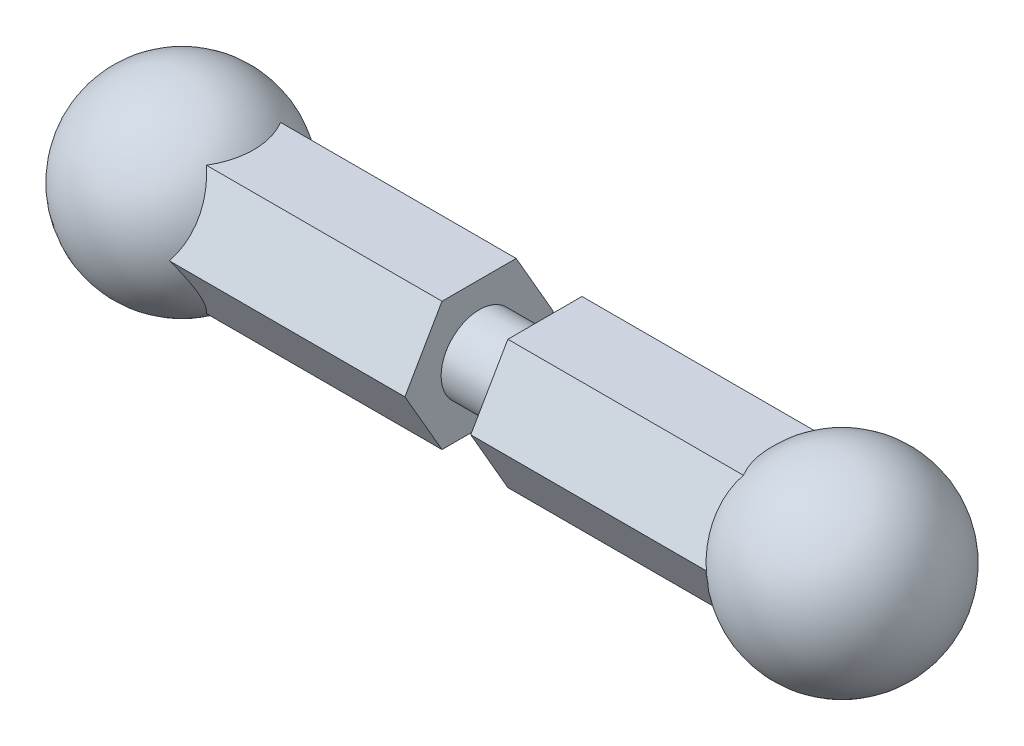
ISO-10303-21;
HEADER;
FILE_DESCRIPTION(('STEP AP214'),'2;1');
FILE_NAME('part.step','',(''),(''),'','','');
FILE_SCHEMA(('AUTOMOTIVE_DESIGN { 1 0 10303 214 1 1 1 1 }'));
ENDSEC;
DATA;
#1=APPLICATION_CONTEXT('core data for automotive mechanical design processes');
#2=APPLICATION_PROTOCOL_DEFINITION('international standard','automotive_design',2000,#1);
#3=PRODUCT_CONTEXT('',#1,'mechanical');
#4=PRODUCT('Part','Part','',(#3));
#5=PRODUCT_RELATED_PRODUCT_CATEGORY('part','',(#4));
#6=PRODUCT_DEFINITION_FORMATION('','',#4);
#7=PRODUCT_DEFINITION_CONTEXT('part definition',#1,'design');
#8=PRODUCT_DEFINITION('design','',#6,#7);
#9=PRODUCT_DEFINITION_SHAPE('','',#8);
#10=(LENGTH_UNIT() NAMED_UNIT(*) SI_UNIT(.MILLI.,.METRE.));
#11=(NAMED_UNIT(*) PLANE_ANGLE_UNIT() SI_UNIT($,.RADIAN.));
#12=(NAMED_UNIT(*) SI_UNIT($,.STERADIAN.) SOLID_ANGLE_UNIT());
#13=UNCERTAINTY_MEASURE_WITH_UNIT(LENGTH_MEASURE(1.E-05),#10,'distance_accuracy_value','');
#14=(GEOMETRIC_REPRESENTATION_CONTEXT(3) GLOBAL_UNCERTAINTY_ASSIGNED_CONTEXT((#13)) GLOBAL_UNIT_ASSIGNED_CONTEXT((#10,
#11,#12)) REPRESENTATION_CONTEXT('',''));
#15=CARTESIAN_POINT('',(0.,0.,0.));
#16=DIRECTION('',(0.,0.,1.));
#17=DIRECTION('',(1.,0.,0.));
#18=AXIS2_PLACEMENT_3D('',#15,#16,#17);
#19=CARTESIAN_POINT('',(11.3,2.,-1.15470053837925));
#20=DIRECTION('',(0.,-1.,0.));
#21=DIRECTION('',(0.,0.,-1.));
#22=AXIS2_PLACEMENT_3D('',#19,#20,#21);
#23=PLANE('',#22);
#24=DIRECTION('',(1.,0.,0.));
#25=VECTOR('',#24,1.);
#26=CARTESIAN_POINT('',(11.3,2.,-1.15470053837925));
#27=LINE('',#26,#25);
#28=CARTESIAN_POINT('',(11.3,2.,-1.15470053837925));
#29=VERTEX_POINT('',#28);
#30=CARTESIAN_POINT('',(18.6351457844873,2.,-1.15470053837925));
#31=VERTEX_POINT('',#30);
#32=EDGE_CURVE('E113',#29,#31,#27,.T.);
#33=ORIENTED_EDGE('',*,*,#32,.F.);
#34=DIRECTION('',(0.,0.,1.));
#35=VECTOR('',#34,1.);
#36=CARTESIAN_POINT('',(11.3,2.,-1.15470053837925));
#37=LINE('',#36,#35);
#38=CARTESIAN_POINT('',(11.3,2.,1.15470053837925));
#39=VERTEX_POINT('',#38);
#40=EDGE_CURVE('E103',#29,#39,#37,.T.);
#41=ORIENTED_EDGE('',*,*,#40,.T.);
#42=DIRECTION('',(1.,0.,0.));
#43=VECTOR('',#42,1.);
#44=CARTESIAN_POINT('',(11.3,2.,1.15470053837925));
#45=LINE('',#44,#43);
#46=CARTESIAN_POINT('',(18.6351457844873,2.,1.15470053837925));
#47=VERTEX_POINT('',#46);
#48=EDGE_CURVE('E67',#39,#47,#45,.T.);
#49=ORIENTED_EDGE('',*,*,#48,.T.);
#50=CARTESIAN_POINT('',(20.55,2.,0.));
#51=DIRECTION('',(0.,1.,0.));
#52=DIRECTION('',(0.,0.,-1.));
#53=AXIS2_PLACEMENT_3D('',#50,#51,#52);
#54=CIRCLE('',#53,2.23606797749979);
#55=EDGE_CURVE('E12',#31,#47,#54,.T.);
#56=ORIENTED_EDGE('',*,*,#55,.F.);
#57=EDGE_LOOP('',(#33,#41,#49,#56));
#58=FACE_BOUND('',#57,.T.);
#59=ADVANCED_FACE('F49',(#58),#23,.F.);
#60=CARTESIAN_POINT('',(11.3,2.,1.15470053837925));
#61=DIRECTION('',(0.,-0.5,-0.866025403784439));
#62=DIRECTION('',(0.,0.866025403784439,-0.5));
#63=AXIS2_PLACEMENT_3D('',#60,#61,#62);
#64=PLANE('',#63);
#65=ORIENTED_EDGE('',*,*,#48,.F.);
#66=DIRECTION('',(0.,-0.866025403784438,0.5));
#67=VECTOR('',#66,1.);
#68=CARTESIAN_POINT('',(11.3,2.,1.15470053837925));
#69=LINE('',#68,#67);
#70=CARTESIAN_POINT('',(11.3,0.,2.3094010767585));
#71=VERTEX_POINT('',#70);
#72=EDGE_CURVE('E101',#39,#71,#69,.T.);
#73=ORIENTED_EDGE('',*,*,#72,.T.);
#74=DIRECTION('',(1.,0.,0.));
#75=VECTOR('',#74,1.);
#76=CARTESIAN_POINT('',(11.3,0.,2.3094010767585));
#77=LINE('',#76,#75);
#78=CARTESIAN_POINT('',(18.6351457844873,0.,2.3094010767585));
#79=VERTEX_POINT('',#78);
#80=EDGE_CURVE('E141',#71,#79,#77,.T.);
#81=ORIENTED_EDGE('',*,*,#80,.T.);
#82=CARTESIAN_POINT('',(20.55,1.,1.73205080756888));
#83=DIRECTION('',(0.,0.5,0.866025403784439));
#84=DIRECTION('',(0.,0.866025403784439,-0.5));
#85=AXIS2_PLACEMENT_3D('',#82,#83,#84);
#86=CIRCLE('',#85,2.23606797749979);
#87=EDGE_CURVE('E57',#47,#79,#86,.T.);
#88=ORIENTED_EDGE('',*,*,#87,.F.);
#89=EDGE_LOOP('',(#65,#73,#81,#88));
#90=FACE_BOUND('',#89,.T.);
#91=ADVANCED_FACE('F109',(#90),#64,.F.);
#92=CARTESIAN_POINT('',(11.3,0.,2.3094010767585));
#93=DIRECTION('',(0.,0.5,-0.866025403784439));
#94=DIRECTION('',(0.,0.866025403784439,0.5));
#95=AXIS2_PLACEMENT_3D('',#92,#93,#94);
#96=PLANE('',#95);
#97=ORIENTED_EDGE('',*,*,#80,.F.);
#98=DIRECTION('',(0.,-0.866025403784439,-0.5));
#99=VECTOR('',#98,1.);
#100=CARTESIAN_POINT('',(11.3,0.,2.3094010767585));
#101=LINE('',#100,#99);
#102=CARTESIAN_POINT('',(11.3,-2.,1.15470053837925));
#103=VERTEX_POINT('',#102);
#104=EDGE_CURVE('E105',#71,#103,#101,.T.);
#105=ORIENTED_EDGE('',*,*,#104,.T.);
#106=DIRECTION('',(1.,0.,0.));
#107=VECTOR('',#106,1.);
#108=CARTESIAN_POINT('',(11.3,-2.,1.15470053837925));
#109=LINE('',#108,#107);
#110=CARTESIAN_POINT('',(18.6351457844873,-2.,1.15470053837925));
#111=VERTEX_POINT('',#110);
#112=EDGE_CURVE('E136',#103,#111,#109,.T.);
#113=ORIENTED_EDGE('',*,*,#112,.T.);
#114=CARTESIAN_POINT('',(20.55,-1.,1.73205080756888));
#115=DIRECTION('',(0.,-0.5,0.866025403784439));
#116=DIRECTION('',(0.,0.866025403784439,0.5));
#117=AXIS2_PLACEMENT_3D('',#114,#115,#116);
#118=CIRCLE('',#117,2.23606797749979);
#119=EDGE_CURVE('E111',#79,#111,#118,.T.);
#120=ORIENTED_EDGE('',*,*,#119,.F.);
#121=EDGE_LOOP('',(#97,#105,#113,#120));
#122=FACE_BOUND('',#121,.T.);
#123=ADVANCED_FACE('F159',(#122),#96,.F.);
#124=CARTESIAN_POINT('',(11.3,-2.,1.15470053837925));
#125=DIRECTION('',(0.,1.,0.));
#126=DIRECTION('',(0.,0.,1.));
#127=AXIS2_PLACEMENT_3D('',#124,#125,#126);
#128=PLANE('',#127);
#129=ORIENTED_EDGE('',*,*,#112,.F.);
#130=DIRECTION('',(0.,0.,-1.));
#131=VECTOR('',#130,1.);
#132=CARTESIAN_POINT('',(11.3,-2.,1.15470053837925));
#133=LINE('',#132,#131);
#134=CARTESIAN_POINT('',(11.3,-2.,-1.15470053837925));
#135=VERTEX_POINT('',#134);
#136=EDGE_CURVE('E120',#103,#135,#133,.T.);
#137=ORIENTED_EDGE('',*,*,#136,.T.);
#138=DIRECTION('',(1.,0.,0.));
#139=VECTOR('',#138,1.);
#140=CARTESIAN_POINT('',(11.3,-2.,-1.15470053837925));
#141=LINE('',#140,#139);
#142=CARTESIAN_POINT('',(18.6351457844873,-2.,-1.15470053837925));
#143=VERTEX_POINT('',#142);
#144=EDGE_CURVE('E131',#135,#143,#141,.T.);
#145=ORIENTED_EDGE('',*,*,#144,.T.);
#146=CARTESIAN_POINT('',(20.55,-2.,0.));
#147=DIRECTION('',(0.,-1.,0.));
#148=DIRECTION('',(0.,0.,1.));
#149=AXIS2_PLACEMENT_3D('',#146,#147,#148);
#150=CIRCLE('',#149,2.23606797749979);
#151=EDGE_CURVE('E138',#111,#143,#150,.T.);
#152=ORIENTED_EDGE('',*,*,#151,.F.);
#153=EDGE_LOOP('',(#129,#137,#145,#152));
#154=FACE_BOUND('',#153,.T.);
#155=ADVANCED_FACE('F157',(#154),#128,.F.);
#156=CARTESIAN_POINT('',(11.3,-2.,-1.15470053837925));
#157=DIRECTION('',(0.,0.5,0.866025403784439));
#158=DIRECTION('',(0.,-0.866025403784439,0.5));
#159=AXIS2_PLACEMENT_3D('',#156,#157,#158);
#160=PLANE('',#159);
#161=ORIENTED_EDGE('',*,*,#144,.F.);
#162=DIRECTION('',(0.,0.866025403784438,-0.5));
#163=VECTOR('',#162,1.);
#164=CARTESIAN_POINT('',(11.3,-2.,-1.15470053837925));
#165=LINE('',#164,#163);
#166=CARTESIAN_POINT('',(11.3,0.,-2.3094010767585));
#167=VERTEX_POINT('',#166);
#168=EDGE_CURVE('E123',#135,#167,#165,.T.);
#169=ORIENTED_EDGE('',*,*,#168,.T.);
#170=DIRECTION('',(1.,0.,0.));
#171=VECTOR('',#170,1.);
#172=CARTESIAN_POINT('',(11.3,0.,-2.3094010767585));
#173=LINE('',#172,#171);
#174=CARTESIAN_POINT('',(18.6351457844873,0.,-2.3094010767585));
#175=VERTEX_POINT('',#174);
#176=EDGE_CURVE('E128',#167,#175,#173,.T.);
#177=ORIENTED_EDGE('',*,*,#176,.T.);
#178=CARTESIAN_POINT('',(20.55,-1.,-1.73205080756888));
#179=DIRECTION('',(0.,-0.5,-0.866025403784439));
#180=DIRECTION('',(0.,-0.866025403784439,0.5));
#181=AXIS2_PLACEMENT_3D('',#178,#179,#180);
#182=CIRCLE('',#181,2.23606797749979);
#183=EDGE_CURVE('E133',#143,#175,#182,.T.);
#184=ORIENTED_EDGE('',*,*,#183,.F.);
#185=EDGE_LOOP('',(#161,#169,#177,#184));
#186=FACE_BOUND('',#185,.T.);
#187=ADVANCED_FACE('F154',(#186),#160,.F.);
#188=CARTESIAN_POINT('',(11.3,0.,-2.3094010767585));
#189=DIRECTION('',(0.,-0.5,0.866025403784439));
#190=DIRECTION('',(0.,-0.866025403784439,-0.5));
#191=AXIS2_PLACEMENT_3D('',#188,#189,#190);
#192=PLANE('',#191);
#193=ORIENTED_EDGE('',*,*,#176,.F.);
#194=DIRECTION('',(0.,0.866025403784439,0.5));
#195=VECTOR('',#194,1.);
#196=CARTESIAN_POINT('',(11.3,0.,-2.3094010767585));
#197=LINE('',#196,#195);
#198=EDGE_CURVE('E126',#167,#29,#197,.T.);
#199=ORIENTED_EDGE('',*,*,#198,.T.);
#200=ORIENTED_EDGE('',*,*,#32,.T.);
#201=CARTESIAN_POINT('',(20.55,1.,-1.73205080756888));
#202=DIRECTION('',(0.,0.5,-0.866025403784439));
#203=DIRECTION('',(0.,-0.866025403784439,-0.5));
#204=AXIS2_PLACEMENT_3D('',#201,#202,#203);
#205=CIRCLE('',#204,2.23606797749979);
#206=EDGE_CURVE('E114',#175,#31,#205,.T.);
#207=ORIENTED_EDGE('',*,*,#206,.F.);
#208=EDGE_LOOP('',(#193,#199,#200,#207));
#209=FACE_BOUND('',#208,.T.);
#210=ADVANCED_FACE('F150',(#209),#192,.F.);
#211=CARTESIAN_POINT('',(11.3,0.,0.));
#212=DIRECTION('',(-1.,0.,0.));
#213=DIRECTION('',(0.,0.,-1.));
#214=AXIS2_PLACEMENT_3D('',#211,#212,#213);
#215=PLANE('',#214);
#216=ORIENTED_EDGE('',*,*,#40,.F.);
#217=ORIENTED_EDGE('',*,*,#198,.F.);
#218=ORIENTED_EDGE('',*,*,#168,.F.);
#219=ORIENTED_EDGE('',*,*,#136,.F.);
#220=ORIENTED_EDGE('',*,*,#104,.F.);
#221=ORIENTED_EDGE('',*,*,#72,.F.);
#222=EDGE_LOOP('',(#216,#217,#218,#219,#220,#221));
#223=FACE_BOUND('',#222,.T.);
#224=ADVANCED_FACE('F102',(#223),#215,.T.);
#225=CARTESIAN_POINT('',(20.55,0.,0.));
#226=DIRECTION('',(0.,1.,0.));
#227=DIRECTION('',(0.,0.,-1.));
#228=AXIS2_PLACEMENT_3D('',#225,#226,#227);
#229=SPHERICAL_SURFACE('',#228,3.);
#230=ORIENTED_EDGE('',*,*,#206,.T.);
#231=ORIENTED_EDGE('',*,*,#55,.T.);
#232=ORIENTED_EDGE('',*,*,#87,.T.);
#233=ORIENTED_EDGE('',*,*,#119,.T.);
#234=ORIENTED_EDGE('',*,*,#151,.T.);
#235=ORIENTED_EDGE('',*,*,#183,.T.);
#236=EDGE_LOOP('',(#230,#231,#232,#233,#234,#235));
#237=FACE_BOUND('',#236,.T.);
#238=ADVANCED_FACE('F51',(#237),#229,.T.);
#239=CLOSED_SHELL('',(#59,#91,#123,#155,#187,#210,#224,#238));
#240=MANIFOLD_SOLID_BREP('B2',#239);
#241=CARTESIAN_POINT('',(0.,0.,0.));
#242=DIRECTION('',(0.,1.,0.));
#243=DIRECTION('',(-1.,0.,0.));
#244=AXIS2_PLACEMENT_3D('',#241,#242,#243);
#245=SPHERICAL_SURFACE('',#244,3.);
#246=CARTESIAN_POINT('',(0.,2.,0.));
#247=DIRECTION('',(0.,-1.,0.));
#248=DIRECTION('',(0.,0.,-1.));
#249=AXIS2_PLACEMENT_3D('',#246,#247,#248);
#250=CIRCLE('',#249,2.23606797749979);
#251=CARTESIAN_POINT('',(1.91485421551268,2.,-1.15470053837925));
#252=VERTEX_POINT('',#251);
#253=CARTESIAN_POINT('',(1.91485421551268,2.,1.15470053837925));
#254=VERTEX_POINT('',#253);
#255=EDGE_CURVE('E47',#252,#254,#250,.T.);
#256=ORIENTED_EDGE('',*,*,#255,.F.);
#257=CARTESIAN_POINT('',(0.,1.,-1.73205080756888));
#258=DIRECTION('',(0.,-0.5,0.866025403784439));
#259=DIRECTION('',(0.,-0.866025403784439,-0.5));
#260=AXIS2_PLACEMENT_3D('',#257,#258,#259);
#261=CIRCLE('',#260,2.23606797749979);
#262=CARTESIAN_POINT('',(1.91485421551268,0.,-2.3094010767585));
#263=VERTEX_POINT('',#262);
#264=EDGE_CURVE('E295',#263,#252,#261,.T.);
#265=ORIENTED_EDGE('',*,*,#264,.F.);
#266=CARTESIAN_POINT('',(0.,-1.,-1.73205080756888));
#267=DIRECTION('',(0.,0.5,0.866025403784439));
#268=DIRECTION('',(0.,-0.866025403784439,0.5));
#269=AXIS2_PLACEMENT_3D('',#266,#267,#268);
#270=CIRCLE('',#269,2.23606797749979);
#271=CARTESIAN_POINT('',(1.91485421551268,-2.,-1.15470053837925));
#272=VERTEX_POINT('',#271);
#273=EDGE_CURVE('E298',#272,#263,#270,.T.);
#274=ORIENTED_EDGE('',*,*,#273,.F.);
#275=CARTESIAN_POINT('',(0.,-2.,0.));
#276=DIRECTION('',(0.,1.,0.));
#277=DIRECTION('',(0.,0.,1.));
#278=AXIS2_PLACEMENT_3D('',#275,#276,#277);
#279=CIRCLE('',#278,2.23606797749979);
#280=CARTESIAN_POINT('',(1.91485421551268,-2.,1.15470053837925));
#281=VERTEX_POINT('',#280);
#282=EDGE_CURVE('E306',#281,#272,#279,.T.);
#283=ORIENTED_EDGE('',*,*,#282,.F.);
#284=CARTESIAN_POINT('',(0.,-1.,1.73205080756888));
#285=DIRECTION('',(0.,0.5,-0.866025403784439));
#286=DIRECTION('',(0.,0.866025403784439,0.5));
#287=AXIS2_PLACEMENT_3D('',#284,#285,#286);
#288=CIRCLE('',#287,2.23606797749979);
#289=CARTESIAN_POINT('',(1.91485421551268,0.,2.3094010767585));
#290=VERTEX_POINT('',#289);
#291=EDGE_CURVE('E242',#290,#281,#288,.T.);
#292=ORIENTED_EDGE('',*,*,#291,.F.);
#293=CARTESIAN_POINT('',(0.,1.,1.73205080756888));
#294=DIRECTION('',(0.,-0.5,-0.866025403784439));
#295=DIRECTION('',(0.,0.866025403784439,-0.5));
#296=AXIS2_PLACEMENT_3D('',#293,#294,#295);
#297=CIRCLE('',#296,2.23606797749979);
#298=EDGE_CURVE('E232',#254,#290,#297,.T.);
#299=ORIENTED_EDGE('',*,*,#298,.F.);
#300=EDGE_LOOP('',(#256,#265,#274,#283,#292,#299));
#301=FACE_BOUND('',#300,.T.);
#302=ADVANCED_FACE('F225',(#301),#245,.T.);
#303=CARTESIAN_POINT('',(9.25,2.,-1.15470053837925));
#304=DIRECTION('',(0.,-1.,0.));
#305=DIRECTION('',(0.,0.,-1.));
#306=AXIS2_PLACEMENT_3D('',#303,#304,#305);
#307=PLANE('',#306);
#308=DIRECTION('',(-1.,0.,0.));
#309=VECTOR('',#308,1.);
#310=CARTESIAN_POINT('',(9.25,2.,-1.15470053837925));
#311=LINE('',#310,#309);
#312=CARTESIAN_POINT('',(9.25,2.,-1.15470053837925));
#313=VERTEX_POINT('',#312);
#314=EDGE_CURVE('E321',#313,#252,#311,.T.);
#315=ORIENTED_EDGE('',*,*,#314,.T.);
#316=ORIENTED_EDGE('',*,*,#255,.T.);
#317=DIRECTION('',(-1.,0.,0.));
#318=VECTOR('',#317,1.);
#319=CARTESIAN_POINT('',(9.25,2.,1.15470053837925));
#320=LINE('',#319,#318);
#321=CARTESIAN_POINT('',(9.25,2.,1.15470053837925));
#322=VERTEX_POINT('',#321);
#323=EDGE_CURVE('E277',#322,#254,#320,.T.);
#324=ORIENTED_EDGE('',*,*,#323,.F.);
#325=DIRECTION('',(0.,0.,1.));
#326=VECTOR('',#325,1.);
#327=CARTESIAN_POINT('',(9.25,2.,-1.15470053837925));
#328=LINE('',#327,#326);
#329=EDGE_CURVE('E283',#313,#322,#328,.T.);
#330=ORIENTED_EDGE('',*,*,#329,.F.);
#331=EDGE_LOOP('',(#315,#316,#324,#330));
#332=FACE_BOUND('',#331,.T.);
#333=ADVANCED_FACE('F294',(#332),#307,.F.);
#334=CARTESIAN_POINT('',(9.25,2.,1.15470053837925));
#335=DIRECTION('',(0.,-0.5,-0.866025403784439));
#336=DIRECTION('',(0.,0.866025403784439,-0.5));
#337=AXIS2_PLACEMENT_3D('',#334,#335,#336);
#338=PLANE('',#337);
#339=ORIENTED_EDGE('',*,*,#323,.T.);
#340=ORIENTED_EDGE('',*,*,#298,.T.);
#341=DIRECTION('',(-1.,0.,0.));
#342=VECTOR('',#341,1.);
#343=CARTESIAN_POINT('',(9.25,0.,2.3094010767585));
#344=LINE('',#343,#342);
#345=CARTESIAN_POINT('',(9.25,0.,2.3094010767585));
#346=VERTEX_POINT('',#345);
#347=EDGE_CURVE('E279',#346,#290,#344,.T.);
#348=ORIENTED_EDGE('',*,*,#347,.F.);
#349=DIRECTION('',(0.,-0.866025403784438,0.5));
#350=VECTOR('',#349,1.);
#351=CARTESIAN_POINT('',(9.25,2.,1.15470053837925));
#352=LINE('',#351,#350);
#353=EDGE_CURVE('E273',#322,#346,#352,.T.);
#354=ORIENTED_EDGE('',*,*,#353,.F.);
#355=EDGE_LOOP('',(#339,#340,#348,#354));
#356=FACE_BOUND('',#355,.T.);
#357=ADVANCED_FACE('F275',(#356),#338,.F.);
#358=CARTESIAN_POINT('',(9.25,0.,2.3094010767585));
#359=DIRECTION('',(0.,0.5,-0.866025403784439));
#360=DIRECTION('',(0.,0.866025403784439,0.5));
#361=AXIS2_PLACEMENT_3D('',#358,#359,#360);
#362=PLANE('',#361);
#363=ORIENTED_EDGE('',*,*,#347,.T.);
#364=ORIENTED_EDGE('',*,*,#291,.T.);
#365=DIRECTION('',(-1.,0.,0.));
#366=VECTOR('',#365,1.);
#367=CARTESIAN_POINT('',(9.25,-2.,1.15470053837925));
#368=LINE('',#367,#366);
#369=CARTESIAN_POINT('',(9.25,-2.,1.15470053837925));
#370=VERTEX_POINT('',#369);
#371=EDGE_CURVE('E300',#370,#281,#368,.T.);
#372=ORIENTED_EDGE('',*,*,#371,.F.);
#373=DIRECTION('',(0.,-0.866025403784439,-0.5));
#374=VECTOR('',#373,1.);
#375=CARTESIAN_POINT('',(9.25,0.,2.3094010767585));
#376=LINE('',#375,#374);
#377=EDGE_CURVE('E282',#346,#370,#376,.T.);
#378=ORIENTED_EDGE('',*,*,#377,.F.);
#379=EDGE_LOOP('',(#363,#364,#372,#378));
#380=FACE_BOUND('',#379,.T.);
#381=ADVANCED_FACE('F310',(#380),#362,.F.);
#382=CARTESIAN_POINT('',(9.25,-2.,1.15470053837925));
#383=DIRECTION('',(0.,1.,0.));
#384=DIRECTION('',(0.,0.,1.));
#385=AXIS2_PLACEMENT_3D('',#382,#383,#384);
#386=PLANE('',#385);
#387=ORIENTED_EDGE('',*,*,#371,.T.);
#388=ORIENTED_EDGE('',*,*,#282,.T.);
#389=DIRECTION('',(-1.,0.,0.));
#390=VECTOR('',#389,1.);
#391=CARTESIAN_POINT('',(9.25,-2.,-1.15470053837925));
#392=LINE('',#391,#390);
#393=CARTESIAN_POINT('',(9.25,-2.,-1.15470053837925));
#394=VERTEX_POINT('',#393);
#395=EDGE_CURVE('E326',#394,#272,#392,.T.);
#396=ORIENTED_EDGE('',*,*,#395,.F.);
#397=DIRECTION('',(0.,0.,-1.));
#398=VECTOR('',#397,1.);
#399=CARTESIAN_POINT('',(9.25,-2.,1.15470053837925));
#400=LINE('',#399,#398);
#401=EDGE_CURVE('E314',#370,#394,#400,.T.);
#402=ORIENTED_EDGE('',*,*,#401,.F.);
#403=EDGE_LOOP('',(#387,#388,#396,#402));
#404=FACE_BOUND('',#403,.T.);
#405=ADVANCED_FACE('F329',(#404),#386,.F.);
#406=CARTESIAN_POINT('',(9.25,-2.,-1.15470053837925));
#407=DIRECTION('',(0.,0.5,0.866025403784439));
#408=DIRECTION('',(0.,-0.866025403784439,0.5));
#409=AXIS2_PLACEMENT_3D('',#406,#407,#408);
#410=PLANE('',#409);
#411=ORIENTED_EDGE('',*,*,#395,.T.);
#412=ORIENTED_EDGE('',*,*,#273,.T.);
#413=DIRECTION('',(-1.,0.,0.));
#414=VECTOR('',#413,1.);
#415=CARTESIAN_POINT('',(9.25,0.,-2.3094010767585));
#416=LINE('',#415,#414);
#417=CARTESIAN_POINT('',(9.25,0.,-2.3094010767585));
#418=VERTEX_POINT('',#417);
#419=EDGE_CURVE('E323',#418,#263,#416,.T.);
#420=ORIENTED_EDGE('',*,*,#419,.F.);
#421=DIRECTION('',(0.,0.866025403784438,-0.5));
#422=VECTOR('',#421,1.);
#423=CARTESIAN_POINT('',(9.25,-2.,-1.15470053837925));
#424=LINE('',#423,#422);
#425=EDGE_CURVE('E316',#394,#418,#424,.T.);
#426=ORIENTED_EDGE('',*,*,#425,.F.);
#427=EDGE_LOOP('',(#411,#412,#420,#426));
#428=FACE_BOUND('',#427,.T.);
#429=ADVANCED_FACE('F334',(#428),#410,.F.);
#430=CARTESIAN_POINT('',(9.25,0.,-2.3094010767585));
#431=DIRECTION('',(0.,-0.5,0.866025403784439));
#432=DIRECTION('',(0.,-0.866025403784439,-0.5));
#433=AXIS2_PLACEMENT_3D('',#430,#431,#432);
#434=PLANE('',#433);
#435=ORIENTED_EDGE('',*,*,#419,.T.);
#436=ORIENTED_EDGE('',*,*,#264,.T.);
#437=ORIENTED_EDGE('',*,*,#314,.F.);
#438=DIRECTION('',(0.,0.866025403784439,0.5));
#439=VECTOR('',#438,1.);
#440=CARTESIAN_POINT('',(9.25,0.,-2.3094010767585));
#441=LINE('',#440,#439);
#442=EDGE_CURVE('E288',#418,#313,#441,.T.);
#443=ORIENTED_EDGE('',*,*,#442,.F.);
#444=EDGE_LOOP('',(#435,#436,#437,#443));
#445=FACE_BOUND('',#444,.T.);
#446=ADVANCED_FACE('F336',(#445),#434,.F.);
#447=CARTESIAN_POINT('',(9.25,0.,0.));
#448=DIRECTION('',(1.,0.,0.));
#449=DIRECTION('',(0.,0.,-1.));
#450=AXIS2_PLACEMENT_3D('',#447,#448,#449);
#451=PLANE('',#450);
#452=CARTESIAN_POINT('',(9.25,0.,-0.00793613059507685));
#453=DIRECTION('',(1.,0.,0.));
#454=DIRECTION('',(0.,0.,-1.));
#455=AXIS2_PLACEMENT_3D('',#452,#453,#454);
#456=CIRCLE('',#455,1.190625);
#457=CARTESIAN_POINT('',(9.25,0.,-1.19856113059508));
#458=VERTEX_POINT('',#457);
#459=EDGE_CURVE('E368',#458,#458,#456,.T.);
#460=ORIENTED_EDGE('',*,*,#459,.F.);
#461=EDGE_LOOP('',(#460));
#462=FACE_BOUND('',#461,.T.);
#463=ORIENTED_EDGE('',*,*,#329,.T.);
#464=ORIENTED_EDGE('',*,*,#353,.T.);
#465=ORIENTED_EDGE('',*,*,#377,.T.);
#466=ORIENTED_EDGE('',*,*,#401,.T.);
#467=ORIENTED_EDGE('',*,*,#425,.T.);
#468=ORIENTED_EDGE('',*,*,#442,.T.);
#469=EDGE_LOOP('',(#463,#464,#465,#466,#467,#468));
#470=FACE_BOUND('',#469,.T.);
#471=ADVANCED_FACE('F286',(#462,#470),#451,.T.);
#472=CARTESIAN_POINT('',(14.6675960454009,0.,-0.00793613059507685));
#473=DIRECTION('',(-1.,0.,0.));
#474=DIRECTION('',(0.,0.,1.));
#475=AXIS2_PLACEMENT_3D('',#472,#473,#474);
#476=CYLINDRICAL_SURFACE('',#475,1.190625);
#477=CARTESIAN_POINT('',(11.3,0.,-0.00793613059507685));
#478=DIRECTION('',(-1.,0.,0.));
#479=DIRECTION('',(0.,0.,1.));
#480=AXIS2_PLACEMENT_3D('',#477,#478,#479);
#481=CIRCLE('',#480,1.190625);
#482=CARTESIAN_POINT('',(11.3,0.,1.18268886940492));
#483=VERTEX_POINT('',#482);
#484=EDGE_CURVE('E292',#483,#483,#481,.T.);
#485=ORIENTED_EDGE('',*,*,#484,.T.);
#486=EDGE_LOOP('',(#485));
#487=FACE_BOUND('',#486,.T.);
#488=ORIENTED_EDGE('',*,*,#459,.T.);
#489=EDGE_LOOP('',(#488));
#490=FACE_BOUND('',#489,.T.);
#491=ADVANCED_FACE('F356',(#487,#490),#476,.T.);
#492=CARTESIAN_POINT('',(11.3,0.,0.));
#493=DIRECTION('',(-1.,0.,0.));
#494=DIRECTION('',(0.,0.,-1.));
#495=AXIS2_PLACEMENT_3D('',#492,#493,#494);
#496=PLANE('',#495);
#497=ORIENTED_EDGE('',*,*,#484,.F.);
#498=EDGE_LOOP('',(#497));
#499=FACE_BOUND('',#498,.T.);
#500=ADVANCED_FACE('F360',(#499),#496,.F.);
#501=CLOSED_SHELL('',(#302,#333,#357,#381,#405,#429,#446,#471,#491,#500));
#502=MANIFOLD_SOLID_BREP('B6',#501);
#503=ADVANCED_BREP_SHAPE_REPRESENTATION('',(#18,#240,#502),#14);
#504=SHAPE_DEFINITION_REPRESENTATION(#9,#503);
ENDSEC;
END-ISO-10303-21;
